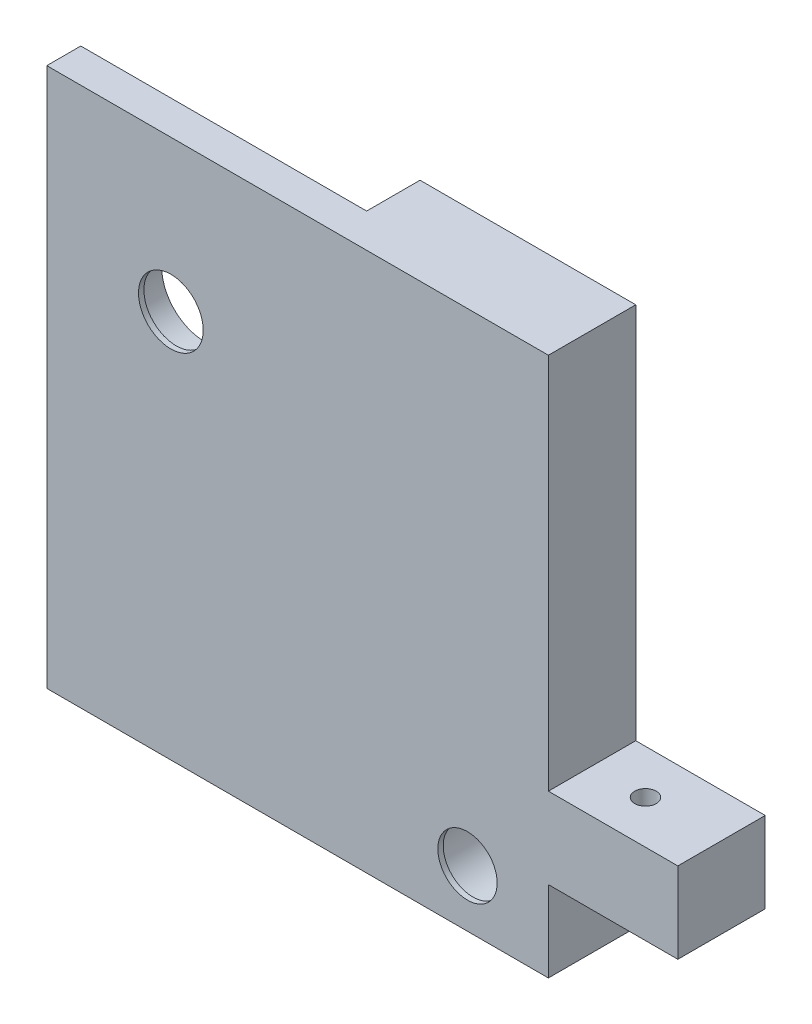
ISO-10303-21;
HEADER;
FILE_DESCRIPTION(('STEP AP214'),'2;1');
FILE_NAME('part.step','',(''),(''),'','','');
FILE_SCHEMA(('AUTOMOTIVE_DESIGN { 1 0 10303 214 1 1 1 1 }'));
ENDSEC;
DATA;
#1=APPLICATION_CONTEXT('core data for automotive mechanical design processes');
#2=APPLICATION_PROTOCOL_DEFINITION('international standard','automotive_design',2000,#1);
#3=PRODUCT_CONTEXT('',#1,'mechanical');
#4=PRODUCT('Part','Part','',(#3));
#5=PRODUCT_RELATED_PRODUCT_CATEGORY('part','',(#4));
#6=PRODUCT_DEFINITION_FORMATION('','',#4);
#7=PRODUCT_DEFINITION_CONTEXT('part definition',#1,'design');
#8=PRODUCT_DEFINITION('design','',#6,#7);
#9=PRODUCT_DEFINITION_SHAPE('','',#8);
#10=(LENGTH_UNIT() NAMED_UNIT(*) SI_UNIT(.MILLI.,.METRE.));
#11=(NAMED_UNIT(*) PLANE_ANGLE_UNIT() SI_UNIT($,.RADIAN.));
#12=(NAMED_UNIT(*) SI_UNIT($,.STERADIAN.) SOLID_ANGLE_UNIT());
#13=UNCERTAINTY_MEASURE_WITH_UNIT(LENGTH_MEASURE(1.E-05),#10,'distance_accuracy_value','');
#14=(GEOMETRIC_REPRESENTATION_CONTEXT(3) GLOBAL_UNCERTAINTY_ASSIGNED_CONTEXT((#13)) GLOBAL_UNIT_ASSIGNED_CONTEXT((#10,
#11,#12)) REPRESENTATION_CONTEXT('',''));
#15=CARTESIAN_POINT('',(0.,0.,0.));
#16=DIRECTION('',(0.,0.,1.));
#17=DIRECTION('',(1.,0.,0.));
#18=AXIS2_PLACEMENT_3D('',#15,#16,#17);
#19=CARTESIAN_POINT('',(1.81294964028777,-24.5719424460432,40.1));
#20=DIRECTION('',(0.,0.,-1.));
#21=DIRECTION('',(-1.,0.,0.));
#22=AXIS2_PLACEMENT_3D('',#19,#20,#21);
#23=CYLINDRICAL_SURFACE('',#22,7.5);
#24=CARTESIAN_POINT('',(1.81294964028777,-24.5719424460432,-9.9));
#25=DIRECTION('',(0.,0.,-1.));
#26=DIRECTION('',(-1.,0.,0.));
#27=AXIS2_PLACEMENT_3D('',#24,#25,#26);
#28=CIRCLE('',#27,7.5);
#29=CARTESIAN_POINT('',(-5.68705035971223,-24.5719424460432,-9.9));
#30=VERTEX_POINT('',#29);
#31=EDGE_CURVE('E289',#30,#30,#28,.T.);
#32=ORIENTED_EDGE('',*,*,#31,.T.);
#33=EDGE_LOOP('',(#32));
#34=FACE_BOUND('',#33,.T.);
#35=CARTESIAN_POINT('',(1.81294964028777,-24.5719424460432,5.3));
#36=DIRECTION('',(0.,0.,1.));
#37=DIRECTION('',(1.,0.,0.));
#38=AXIS2_PLACEMENT_3D('',#35,#36,#37);
#39=CIRCLE('',#38,7.5);
#40=CARTESIAN_POINT('',(9.31294964028777,-24.5719424460432,5.3));
#41=VERTEX_POINT('',#40);
#42=EDGE_CURVE('E12',#41,#41,#39,.F.);
#43=ORIENTED_EDGE('',*,*,#42,.F.);
#44=EDGE_LOOP('',(#43));
#45=FACE_BOUND('',#44,.T.);
#46=ADVANCED_FACE('F47',(#34,#45),#23,.F.);
#47=CARTESIAN_POINT('',(-53.1870503597122,36.9280575539568,50.));
#48=DIRECTION('',(0.,0.,-1.));
#49=DIRECTION('',(-1.,0.,0.));
#50=AXIS2_PLACEMENT_3D('',#47,#48,#49);
#51=CYLINDRICAL_SURFACE('',#50,8.);
#52=CARTESIAN_POINT('',(-53.1870503597122,36.9280575539568,0.));
#53=DIRECTION('',(0.,0.,-1.));
#54=DIRECTION('',(-1.,0.,0.));
#55=AXIS2_PLACEMENT_3D('',#52,#53,#54);
#56=CIRCLE('',#55,8.);
#57=CARTESIAN_POINT('',(-61.1870503597122,36.9280575539568,0.));
#58=VERTEX_POINT('',#57);
#59=EDGE_CURVE('E292',#58,#58,#56,.T.);
#60=ORIENTED_EDGE('',*,*,#59,.T.);
#61=EDGE_LOOP('',(#60));
#62=FACE_BOUND('',#61,.T.);
#63=CARTESIAN_POINT('',(-53.1870503597122,36.9280575539568,5.3));
#64=DIRECTION('',(0.,0.,1.));
#65=DIRECTION('',(1.,0.,0.));
#66=AXIS2_PLACEMENT_3D('',#63,#64,#65);
#67=CIRCLE('',#66,8.);
#68=CARTESIAN_POINT('',(-45.1870503597122,36.9280575539568,5.3));
#69=VERTEX_POINT('',#68);
#70=EDGE_CURVE('E55',#69,#69,#67,.F.);
#71=ORIENTED_EDGE('',*,*,#70,.F.);
#72=EDGE_LOOP('',(#71));
#73=FACE_BOUND('',#72,.T.);
#74=ADVANCED_FACE('F205',(#62,#73),#51,.F.);
#75=CARTESIAN_POINT('',(16.8129496402878,64.9280575539568,6.3));
#76=DIRECTION('',(1.,0.,0.));
#77=DIRECTION('',(0.,1.,0.));
#78=AXIS2_PLACEMENT_3D('',#75,#76,#77);
#79=PLANE('',#78);
#80=DIRECTION('',(0.,0.,1.));
#81=VECTOR('',#80,1.);
#82=CARTESIAN_POINT('',(16.8129496402878,-5.07194244604315,6.3));
#83=LINE('',#82,#81);
#84=CARTESIAN_POINT('',(16.8129496402878,-5.07194244604316,-9.9));
#85=VERTEX_POINT('',#84);
#86=CARTESIAN_POINT('',(16.8129496402878,-5.07194244604316,6.3));
#87=VERTEX_POINT('',#86);
#88=EDGE_CURVE('E143',#85,#87,#83,.T.);
#89=ORIENTED_EDGE('',*,*,#88,.F.);
#90=DIRECTION('',(0.,-1.,0.));
#91=VECTOR('',#90,1.);
#92=CARTESIAN_POINT('',(16.8129496402878,64.9280575539568,-9.9));
#93=LINE('',#92,#91);
#94=CARTESIAN_POINT('',(16.8129496402878,64.9280575539568,-9.9));
#95=VERTEX_POINT('',#94);
#96=EDGE_CURVE('E159',#95,#85,#93,.T.);
#97=ORIENTED_EDGE('',*,*,#96,.F.);
#98=DIRECTION('',(0.,0.,-1.));
#99=VECTOR('',#98,1.);
#100=CARTESIAN_POINT('',(16.8129496402878,64.9280575539568,6.3));
#101=LINE('',#100,#99);
#102=CARTESIAN_POINT('',(16.8129496402878,64.9280575539568,6.3));
#103=VERTEX_POINT('',#102);
#104=EDGE_CURVE('E193',#103,#95,#101,.T.);
#105=ORIENTED_EDGE('',*,*,#104,.F.);
#106=DIRECTION('',(0.,-1.,0.));
#107=VECTOR('',#106,1.);
#108=CARTESIAN_POINT('',(16.8129496402878,64.9280575539568,6.3));
#109=LINE('',#108,#107);
#110=EDGE_CURVE('E70',#103,#87,#109,.T.);
#111=ORIENTED_EDGE('',*,*,#110,.T.);
#112=EDGE_LOOP('',(#89,#97,#105,#111));
#113=FACE_BOUND('',#112,.T.);
#114=ADVANCED_FACE('F207',(#113),#79,.T.);
#115=CARTESIAN_POINT('',(0.,0.,0.));
#116=DIRECTION('',(0.,0.,1.));
#117=DIRECTION('',(1.,0.,0.));
#118=AXIS2_PLACEMENT_3D('',#115,#116,#117);
#119=PLANE('',#118);
#120=ORIENTED_EDGE('',*,*,#59,.F.);
#121=EDGE_LOOP('',(#120));
#122=FACE_BOUND('',#121,.T.);
#123=DIRECTION('',(0.,1.,0.));
#124=VECTOR('',#123,1.);
#125=CARTESIAN_POINT('',(-23.1870503597122,64.9280575539568,0.));
#126=LINE('',#125,#124);
#127=CARTESIAN_POINT('',(-23.1870503597123,-35.0719424460432,0.));
#128=VERTEX_POINT('',#127);
#129=CARTESIAN_POINT('',(-23.1870503597122,64.9280575539568,0.));
#130=VERTEX_POINT('',#129);
#131=EDGE_CURVE('E150',#128,#130,#126,.T.);
#132=ORIENTED_EDGE('',*,*,#131,.F.);
#133=DIRECTION('',(1.,0.,0.));
#134=VECTOR('',#133,1.);
#135=CARTESIAN_POINT('',(-76.1870503597122,-35.0719424460432,0.));
#136=LINE('',#135,#134);
#137=CARTESIAN_POINT('',(-76.1870503597122,-35.0719424460432,0.));
#138=VERTEX_POINT('',#137);
#139=EDGE_CURVE('E188',#138,#128,#136,.T.);
#140=ORIENTED_EDGE('',*,*,#139,.F.);
#141=DIRECTION('',(0.,-1.,0.));
#142=VECTOR('',#141,1.);
#143=CARTESIAN_POINT('',(-76.1870503597122,64.9280575539568,0.));
#144=LINE('',#143,#142);
#145=CARTESIAN_POINT('',(-76.1870503597122,64.9280575539568,0.));
#146=VERTEX_POINT('',#145);
#147=EDGE_CURVE('E175',#146,#138,#144,.T.);
#148=ORIENTED_EDGE('',*,*,#147,.F.);
#149=DIRECTION('',(1.,0.,0.));
#150=VECTOR('',#149,1.);
#151=CARTESIAN_POINT('',(-76.1870503597122,64.9280575539568,0.));
#152=LINE('',#151,#150);
#153=EDGE_CURVE('E179',#146,#130,#152,.T.);
#154=ORIENTED_EDGE('',*,*,#153,.T.);
#155=EDGE_LOOP('',(#132,#140,#148,#154));
#156=FACE_BOUND('',#155,.T.);
#157=ADVANCED_FACE('F214',(#122,#156),#119,.F.);
#158=CARTESIAN_POINT('',(-76.1870503597122,64.9280575539568,6.3));
#159=DIRECTION('',(1.,0.,0.));
#160=DIRECTION('',(0.,0.,-1.));
#161=AXIS2_PLACEMENT_3D('',#158,#159,#160);
#162=PLANE('',#161);
#163=ORIENTED_EDGE('',*,*,#147,.T.);
#164=DIRECTION('',(0.,0.,-1.));
#165=VECTOR('',#164,1.);
#166=CARTESIAN_POINT('',(-76.1870503597122,-35.0719424460432,6.3));
#167=LINE('',#166,#165);
#168=CARTESIAN_POINT('',(-76.1870503597122,-35.0719424460432,6.3));
#169=VERTEX_POINT('',#168);
#170=EDGE_CURVE('E198',#169,#138,#167,.T.);
#171=ORIENTED_EDGE('',*,*,#170,.F.);
#172=DIRECTION('',(0.,-1.,0.));
#173=VECTOR('',#172,1.);
#174=CARTESIAN_POINT('',(-76.1870503597122,64.9280575539568,6.3));
#175=LINE('',#174,#173);
#176=CARTESIAN_POINT('',(-76.1870503597122,64.9280575539568,6.3));
#177=VERTEX_POINT('',#176);
#178=EDGE_CURVE('E176',#177,#169,#175,.T.);
#179=ORIENTED_EDGE('',*,*,#178,.F.);
#180=DIRECTION('',(0.,0.,-1.));
#181=VECTOR('',#180,1.);
#182=CARTESIAN_POINT('',(-76.1870503597122,64.9280575539568,6.3));
#183=LINE('',#182,#181);
#184=EDGE_CURVE('E185',#177,#146,#183,.T.);
#185=ORIENTED_EDGE('',*,*,#184,.T.);
#186=EDGE_LOOP('',(#163,#171,#179,#185));
#187=FACE_BOUND('',#186,.T.);
#188=ADVANCED_FACE('F49',(#187),#162,.F.);
#189=CARTESIAN_POINT('',(-76.1870503597122,-35.0719424460432,6.3));
#190=DIRECTION('',(0.,1.,0.));
#191=DIRECTION('',(0.,0.,1.));
#192=AXIS2_PLACEMENT_3D('',#189,#190,#191);
#193=PLANE('',#192);
#194=ORIENTED_EDGE('',*,*,#139,.T.);
#195=DIRECTION('',(0.,0.,1.));
#196=VECTOR('',#195,1.);
#197=CARTESIAN_POINT('',(-23.1870503597123,-35.0719424460432,-9.9));
#198=LINE('',#197,#196);
#199=CARTESIAN_POINT('',(-23.1870503597123,-35.0719424460432,-9.9));
#200=VERTEX_POINT('',#199);
#201=EDGE_CURVE('E172',#200,#128,#198,.T.);
#202=ORIENTED_EDGE('',*,*,#201,.F.);
#203=DIRECTION('',(-1.,0.,0.));
#204=VECTOR('',#203,1.);
#205=CARTESIAN_POINT('',(16.8129496402877,-35.0719424460432,-9.9));
#206=LINE('',#205,#204);
#207=CARTESIAN_POINT('',(16.8129496402877,-35.0719424460432,-9.9));
#208=VERTEX_POINT('',#207);
#209=EDGE_CURVE('E162',#208,#200,#206,.T.);
#210=ORIENTED_EDGE('',*,*,#209,.F.);
#211=DIRECTION('',(0.,0.,-1.));
#212=VECTOR('',#211,1.);
#213=CARTESIAN_POINT('',(16.8129496402878,-35.0719424460432,6.3));
#214=LINE('',#213,#212);
#215=CARTESIAN_POINT('',(16.8129496402878,-35.0719424460432,6.3));
#216=VERTEX_POINT('',#215);
#217=EDGE_CURVE('E195',#216,#208,#214,.T.);
#218=ORIENTED_EDGE('',*,*,#217,.F.);
#219=DIRECTION('',(1.,0.,0.));
#220=VECTOR('',#219,1.);
#221=CARTESIAN_POINT('',(-76.1870503597122,-35.0719424460432,6.3));
#222=LINE('',#221,#220);
#223=EDGE_CURVE('E178',#169,#216,#222,.T.);
#224=ORIENTED_EDGE('',*,*,#223,.F.);
#225=ORIENTED_EDGE('',*,*,#170,.T.);
#226=EDGE_LOOP('',(#194,#202,#210,#218,#224,#225));
#227=FACE_BOUND('',#226,.T.);
#228=ADVANCED_FACE('F253',(#227),#193,.F.);
#229=DIRECTION('',(0.,0.,-1.));
#230=VECTOR('',#229,1.);
#231=CARTESIAN_POINT('',(16.8129496402878,-20.0719424460432,6.3));
#232=LINE('',#231,#230);
#233=CARTESIAN_POINT('',(16.8129496402878,-20.0719424460432,6.3));
#234=VERTEX_POINT('',#233);
#235=CARTESIAN_POINT('',(16.8129496402878,-20.0719424460432,-9.9));
#236=VERTEX_POINT('',#235);
#237=EDGE_CURVE('E62',#234,#236,#232,.T.);
#238=ORIENTED_EDGE('',*,*,#237,.F.);
#239=EDGE_CURVE('E149',#234,#216,#109,.T.);
#240=ORIENTED_EDGE('',*,*,#239,.T.);
#241=ORIENTED_EDGE('',*,*,#217,.T.);
#242=EDGE_CURVE('E153',#236,#208,#93,.T.);
#243=ORIENTED_EDGE('',*,*,#242,.F.);
#244=EDGE_LOOP('',(#238,#240,#241,#243));
#245=FACE_BOUND('',#244,.T.);
#246=ADVANCED_FACE('F216',(#245),#79,.T.);
#247=CARTESIAN_POINT('',(-76.1870503597122,64.9280575539568,6.3));
#248=DIRECTION('',(0.,1.,0.));
#249=DIRECTION('',(0.,0.,1.));
#250=AXIS2_PLACEMENT_3D('',#247,#248,#249);
#251=PLANE('',#250);
#252=ORIENTED_EDGE('',*,*,#153,.F.);
#253=ORIENTED_EDGE('',*,*,#184,.F.);
#254=DIRECTION('',(1.,0.,0.));
#255=VECTOR('',#254,1.);
#256=CARTESIAN_POINT('',(-76.1870503597122,64.9280575539568,6.3));
#257=LINE('',#256,#255);
#258=EDGE_CURVE('E182',#177,#103,#257,.T.);
#259=ORIENTED_EDGE('',*,*,#258,.T.);
#260=ORIENTED_EDGE('',*,*,#104,.T.);
#261=DIRECTION('',(1.,0.,0.));
#262=VECTOR('',#261,1.);
#263=CARTESIAN_POINT('',(16.8129496402878,64.9280575539568,-9.9));
#264=LINE('',#263,#262);
#265=CARTESIAN_POINT('',(-23.1870503597122,64.9280575539568,-9.9));
#266=VERTEX_POINT('',#265);
#267=EDGE_CURVE('E166',#266,#95,#264,.T.);
#268=ORIENTED_EDGE('',*,*,#267,.F.);
#269=DIRECTION('',(0.,0.,1.));
#270=VECTOR('',#269,1.);
#271=CARTESIAN_POINT('',(-23.1870503597122,64.9280575539568,-9.9));
#272=LINE('',#271,#270);
#273=EDGE_CURVE('E168',#266,#130,#272,.T.);
#274=ORIENTED_EDGE('',*,*,#273,.T.);
#275=EDGE_LOOP('',(#252,#253,#259,#260,#268,#274));
#276=FACE_BOUND('',#275,.T.);
#277=ADVANCED_FACE('F246',(#276),#251,.T.);
#278=CARTESIAN_POINT('',(0.,0.,6.3));
#279=DIRECTION('',(0.,0.,1.));
#280=DIRECTION('',(1.,0.,0.));
#281=AXIS2_PLACEMENT_3D('',#278,#279,#280);
#282=PLANE('',#281);
#283=ORIENTED_EDGE('',*,*,#178,.T.);
#284=ORIENTED_EDGE('',*,*,#223,.T.);
#285=ORIENTED_EDGE('',*,*,#239,.F.);
#286=DIRECTION('',(-1.,0.,0.));
#287=VECTOR('',#286,1.);
#288=CARTESIAN_POINT('',(40.8129496402878,-20.0719424460432,6.3));
#289=LINE('',#288,#287);
#290=CARTESIAN_POINT('',(40.8129496402878,-20.0719424460432,6.3));
#291=VERTEX_POINT('',#290);
#292=EDGE_CURVE('E128',#291,#234,#289,.T.);
#293=ORIENTED_EDGE('',*,*,#292,.F.);
#294=DIRECTION('',(0.,-1.,0.));
#295=VECTOR('',#294,1.);
#296=CARTESIAN_POINT('',(40.8129496402878,-5.07194244604315,6.3));
#297=LINE('',#296,#295);
#298=CARTESIAN_POINT('',(40.8129496402878,-5.07194244604315,6.3));
#299=VERTEX_POINT('',#298);
#300=EDGE_CURVE('E134',#299,#291,#297,.T.);
#301=ORIENTED_EDGE('',*,*,#300,.F.);
#302=DIRECTION('',(-1.,0.,0.));
#303=VECTOR('',#302,1.);
#304=CARTESIAN_POINT('',(40.8129496402878,-5.07194244604315,6.3));
#305=LINE('',#304,#303);
#306=EDGE_CURVE('E274',#299,#87,#305,.T.);
#307=ORIENTED_EDGE('',*,*,#306,.T.);
#308=ORIENTED_EDGE('',*,*,#110,.F.);
#309=ORIENTED_EDGE('',*,*,#258,.F.);
#310=EDGE_LOOP('',(#283,#284,#285,#293,#301,#307,#308,#309));
#311=FACE_BOUND('',#310,.T.);
#312=CARTESIAN_POINT('',(-53.1870503597122,36.9280575539568,6.3));
#313=DIRECTION('',(0.,0.,1.));
#314=DIRECTION('',(1.,0.,0.));
#315=AXIS2_PLACEMENT_3D('',#312,#313,#314);
#316=CIRCLE('',#315,6.);
#317=CARTESIAN_POINT('',(-47.1870503597122,36.9280575539568,6.3));
#318=VERTEX_POINT('',#317);
#319=EDGE_CURVE('E295',#318,#318,#316,.T.);
#320=ORIENTED_EDGE('',*,*,#319,.F.);
#321=EDGE_LOOP('',(#320));
#322=FACE_BOUND('',#321,.T.);
#323=CARTESIAN_POINT('',(1.81294964028777,-24.5719424460432,6.3));
#324=DIRECTION('',(0.,0.,1.));
#325=DIRECTION('',(1.,0.,0.));
#326=AXIS2_PLACEMENT_3D('',#323,#324,#325);
#327=CIRCLE('',#326,5.5);
#328=CARTESIAN_POINT('',(7.31294964028777,-24.5719424460432,6.3));
#329=VERTEX_POINT('',#328);
#330=EDGE_CURVE('E301',#329,#329,#327,.T.);
#331=ORIENTED_EDGE('',*,*,#330,.F.);
#332=EDGE_LOOP('',(#331));
#333=FACE_BOUND('',#332,.T.);
#334=ADVANCED_FACE('F146',(#311,#322,#333),#282,.T.);
#335=CARTESIAN_POINT('',(-23.1870503597122,64.9280575539568,-9.9));
#336=DIRECTION('',(1.,0.,0.));
#337=DIRECTION('',(0.,1.,0.));
#338=AXIS2_PLACEMENT_3D('',#335,#336,#337);
#339=PLANE('',#338);
#340=ORIENTED_EDGE('',*,*,#131,.T.);
#341=ORIENTED_EDGE('',*,*,#273,.F.);
#342=DIRECTION('',(0.,1.,0.));
#343=VECTOR('',#342,1.);
#344=CARTESIAN_POINT('',(-23.1870503597122,64.9280575539568,-9.9));
#345=LINE('',#344,#343);
#346=EDGE_CURVE('E164',#200,#266,#345,.T.);
#347=ORIENTED_EDGE('',*,*,#346,.F.);
#348=ORIENTED_EDGE('',*,*,#201,.T.);
#349=EDGE_LOOP('',(#340,#341,#347,#348));
#350=FACE_BOUND('',#349,.T.);
#351=ADVANCED_FACE('F239',(#350),#339,.F.);
#352=CARTESIAN_POINT('',(0.,0.,-9.9));
#353=DIRECTION('',(0.,0.,-1.));
#354=DIRECTION('',(-1.,0.,0.));
#355=AXIS2_PLACEMENT_3D('',#352,#353,#354);
#356=PLANE('',#355);
#357=ORIENTED_EDGE('',*,*,#31,.F.);
#358=EDGE_LOOP('',(#357));
#359=FACE_BOUND('',#358,.T.);
#360=ORIENTED_EDGE('',*,*,#96,.T.);
#361=DIRECTION('',(-1.,0.,0.));
#362=VECTOR('',#361,1.);
#363=CARTESIAN_POINT('',(40.8129496402878,-5.07194244604315,-9.9));
#364=LINE('',#363,#362);
#365=CARTESIAN_POINT('',(40.8129496402878,-5.07194244604315,-9.9));
#366=VERTEX_POINT('',#365);
#367=EDGE_CURVE('E155',#366,#85,#364,.T.);
#368=ORIENTED_EDGE('',*,*,#367,.F.);
#369=DIRECTION('',(0.,1.,0.));
#370=VECTOR('',#369,1.);
#371=CARTESIAN_POINT('',(40.8129496402878,-5.07194244604315,-9.9));
#372=LINE('',#371,#370);
#373=CARTESIAN_POINT('',(40.8129496402878,-20.0719424460432,-9.9));
#374=VERTEX_POINT('',#373);
#375=EDGE_CURVE('E133',#374,#366,#372,.T.);
#376=ORIENTED_EDGE('',*,*,#375,.F.);
#377=DIRECTION('',(-1.,0.,0.));
#378=VECTOR('',#377,1.);
#379=CARTESIAN_POINT('',(40.8129496402878,-20.0719424460432,-9.9));
#380=LINE('',#379,#378);
#381=EDGE_CURVE('E130',#374,#236,#380,.T.);
#382=ORIENTED_EDGE('',*,*,#381,.T.);
#383=ORIENTED_EDGE('',*,*,#242,.T.);
#384=ORIENTED_EDGE('',*,*,#209,.T.);
#385=ORIENTED_EDGE('',*,*,#346,.T.);
#386=ORIENTED_EDGE('',*,*,#267,.T.);
#387=EDGE_LOOP('',(#360,#368,#376,#382,#383,#384,#385,#386));
#388=FACE_BOUND('',#387,.T.);
#389=ADVANCED_FACE('F235',(#359,#388),#356,.T.);
#390=CARTESIAN_POINT('',(40.8129496402878,-20.0719424460432,6.3));
#391=DIRECTION('',(0.,1.,0.));
#392=DIRECTION('',(-1.,0.,0.));
#393=AXIS2_PLACEMENT_3D('',#390,#391,#392);
#394=PLANE('',#393);
#395=CARTESIAN_POINT('',(26.8129496402877,-20.0719424460432,-1.7));
#396=DIRECTION('',(0.,1.,0.));
#397=DIRECTION('',(-1.,0.,0.));
#398=AXIS2_PLACEMENT_3D('',#395,#396,#397);
#399=CIRCLE('',#398,2.);
#400=CARTESIAN_POINT('',(24.8129496402878,-20.0719424460432,-1.7));
#401=VERTEX_POINT('',#400);
#402=EDGE_CURVE('E281',#401,#401,#399,.T.);
#403=ORIENTED_EDGE('',*,*,#402,.T.);
#404=EDGE_LOOP('',(#403));
#405=FACE_BOUND('',#404,.T.);
#406=ORIENTED_EDGE('',*,*,#237,.T.);
#407=ORIENTED_EDGE('',*,*,#381,.F.);
#408=DIRECTION('',(0.,0.,-1.));
#409=VECTOR('',#408,1.);
#410=CARTESIAN_POINT('',(40.8129496402878,-20.0719424460432,6.3));
#411=LINE('',#410,#409);
#412=EDGE_CURVE('E124',#291,#374,#411,.T.);
#413=ORIENTED_EDGE('',*,*,#412,.F.);
#414=ORIENTED_EDGE('',*,*,#292,.T.);
#415=EDGE_LOOP('',(#406,#407,#413,#414));
#416=FACE_BOUND('',#415,.T.);
#417=ADVANCED_FACE('F126',(#405,#416),#394,.F.);
#418=CARTESIAN_POINT('',(40.8129496402878,-5.07194244604315,6.3));
#419=DIRECTION('',(0.,-1.,0.));
#420=DIRECTION('',(1.,0.,0.));
#421=AXIS2_PLACEMENT_3D('',#418,#419,#420);
#422=PLANE('',#421);
#423=CARTESIAN_POINT('',(26.8129496402877,-5.07194244604315,-1.7));
#424=DIRECTION('',(0.,1.,0.));
#425=DIRECTION('',(-1.,0.,0.));
#426=AXIS2_PLACEMENT_3D('',#423,#424,#425);
#427=CIRCLE('',#426,2.);
#428=CARTESIAN_POINT('',(24.8129496402878,-5.07194244604315,-1.7));
#429=VERTEX_POINT('',#428);
#430=EDGE_CURVE('E286',#429,#429,#427,.T.);
#431=ORIENTED_EDGE('',*,*,#430,.F.);
#432=EDGE_LOOP('',(#431));
#433=FACE_BOUND('',#432,.T.);
#434=ORIENTED_EDGE('',*,*,#88,.T.);
#435=ORIENTED_EDGE('',*,*,#306,.F.);
#436=DIRECTION('',(0.,0.,1.));
#437=VECTOR('',#436,1.);
#438=CARTESIAN_POINT('',(40.8129496402878,-5.07194244604315,6.3));
#439=LINE('',#438,#437);
#440=EDGE_CURVE('E139',#366,#299,#439,.T.);
#441=ORIENTED_EDGE('',*,*,#440,.F.);
#442=ORIENTED_EDGE('',*,*,#367,.T.);
#443=EDGE_LOOP('',(#434,#435,#441,#442));
#444=FACE_BOUND('',#443,.T.);
#445=ADVANCED_FACE('F229',(#433,#444),#422,.F.);
#446=CARTESIAN_POINT('',(40.8129496402878,0.,0.));
#447=DIRECTION('',(1.,0.,0.));
#448=DIRECTION('',(0.,0.,-1.));
#449=AXIS2_PLACEMENT_3D('',#446,#447,#448);
#450=PLANE('',#449);
#451=ORIENTED_EDGE('',*,*,#300,.T.);
#452=ORIENTED_EDGE('',*,*,#412,.T.);
#453=ORIENTED_EDGE('',*,*,#375,.T.);
#454=ORIENTED_EDGE('',*,*,#440,.T.);
#455=EDGE_LOOP('',(#451,#452,#453,#454));
#456=FACE_BOUND('',#455,.T.);
#457=ADVANCED_FACE('F137',(#456),#450,.T.);
#458=CARTESIAN_POINT('',(26.8129496402878,-55.0719424460432,-1.7));
#459=DIRECTION('',(0.,1.,0.));
#460=DIRECTION('',(-1.,0.,0.));
#461=AXIS2_PLACEMENT_3D('',#458,#459,#460);
#462=CYLINDRICAL_SURFACE('',#461,2.);
#463=ORIENTED_EDGE('',*,*,#430,.T.);
#464=EDGE_LOOP('',(#463));
#465=FACE_BOUND('',#464,.T.);
#466=ORIENTED_EDGE('',*,*,#402,.F.);
#467=EDGE_LOOP('',(#466));
#468=FACE_BOUND('',#467,.T.);
#469=ADVANCED_FACE('F223',(#465,#468),#462,.F.);
#470=CARTESIAN_POINT('',(-53.1870503597122,36.9280575539568,5.3));
#471=DIRECTION('',(0.,0.,1.));
#472=DIRECTION('',(1.,0.,0.));
#473=AXIS2_PLACEMENT_3D('',#470,#471,#472);
#474=PLANE('',#473);
#475=CARTESIAN_POINT('',(-53.1870503597122,36.9280575539568,5.3));
#476=DIRECTION('',(0.,0.,1.));
#477=DIRECTION('',(1.,0.,0.));
#478=AXIS2_PLACEMENT_3D('',#475,#476,#477);
#479=CIRCLE('',#478,6.);
#480=CARTESIAN_POINT('',(-47.1870503597122,36.9280575539568,5.3));
#481=VERTEX_POINT('',#480);
#482=EDGE_CURVE('E294',#481,#481,#479,.T.);
#483=ORIENTED_EDGE('',*,*,#482,.T.);
#484=EDGE_LOOP('',(#483));
#485=FACE_BOUND('',#484,.T.);
#486=ORIENTED_EDGE('',*,*,#70,.T.);
#487=EDGE_LOOP('',(#486));
#488=FACE_BOUND('',#487,.T.);
#489=ADVANCED_FACE('F203',(#485,#488),#474,.F.);
#490=CARTESIAN_POINT('',(-53.1870503597122,36.9280575539568,5.3));
#491=DIRECTION('',(0.,0.,1.));
#492=DIRECTION('',(1.,0.,0.));
#493=AXIS2_PLACEMENT_3D('',#490,#491,#492);
#494=CYLINDRICAL_SURFACE('',#493,6.);
#495=ORIENTED_EDGE('',*,*,#482,.F.);
#496=EDGE_LOOP('',(#495));
#497=FACE_BOUND('',#496,.T.);
#498=ORIENTED_EDGE('',*,*,#319,.T.);
#499=EDGE_LOOP('',(#498));
#500=FACE_BOUND('',#499,.T.);
#501=ADVANCED_FACE('F319',(#497,#500),#494,.F.);
#502=CARTESIAN_POINT('',(1.81294964028777,-24.5719424460432,5.3));
#503=DIRECTION('',(0.,0.,1.));
#504=DIRECTION('',(1.,0.,0.));
#505=AXIS2_PLACEMENT_3D('',#502,#503,#504);
#506=PLANE('',#505);
#507=CARTESIAN_POINT('',(1.81294964028777,-24.5719424460432,5.3));
#508=DIRECTION('',(0.,0.,1.));
#509=DIRECTION('',(1.,0.,0.));
#510=AXIS2_PLACEMENT_3D('',#507,#508,#509);
#511=CIRCLE('',#510,5.5);
#512=CARTESIAN_POINT('',(7.31294964028777,-24.5719424460432,5.3));
#513=VERTEX_POINT('',#512);
#514=EDGE_CURVE('E298',#513,#513,#511,.T.);
#515=ORIENTED_EDGE('',*,*,#514,.T.);
#516=EDGE_LOOP('',(#515));
#517=FACE_BOUND('',#516,.T.);
#518=ORIENTED_EDGE('',*,*,#42,.T.);
#519=EDGE_LOOP('',(#518));
#520=FACE_BOUND('',#519,.T.);
#521=ADVANCED_FACE('F307',(#517,#520),#506,.F.);
#522=CARTESIAN_POINT('',(1.81294964028777,-24.5719424460432,5.3));
#523=DIRECTION('',(0.,0.,1.));
#524=DIRECTION('',(1.,0.,0.));
#525=AXIS2_PLACEMENT_3D('',#522,#523,#524);
#526=CYLINDRICAL_SURFACE('',#525,5.5);
#527=ORIENTED_EDGE('',*,*,#514,.F.);
#528=EDGE_LOOP('',(#527));
#529=FACE_BOUND('',#528,.T.);
#530=ORIENTED_EDGE('',*,*,#330,.T.);
#531=EDGE_LOOP('',(#530));
#532=FACE_BOUND('',#531,.T.);
#533=ADVANCED_FACE('F310',(#529,#532),#526,.F.);
#534=CLOSED_SHELL('',(#46,#74,#114,#157,#188,#228,#246,#277,#334,#351,#389,#417,#445,#457,#469,
#489,#501,#521,#533));
#535=MANIFOLD_SOLID_BREP('B2',#534);
#536=ADVANCED_BREP_SHAPE_REPRESENTATION('',(#18,#535),#14);
#537=SHAPE_DEFINITION_REPRESENTATION(#9,#536);
ENDSEC;
END-ISO-10303-21;
